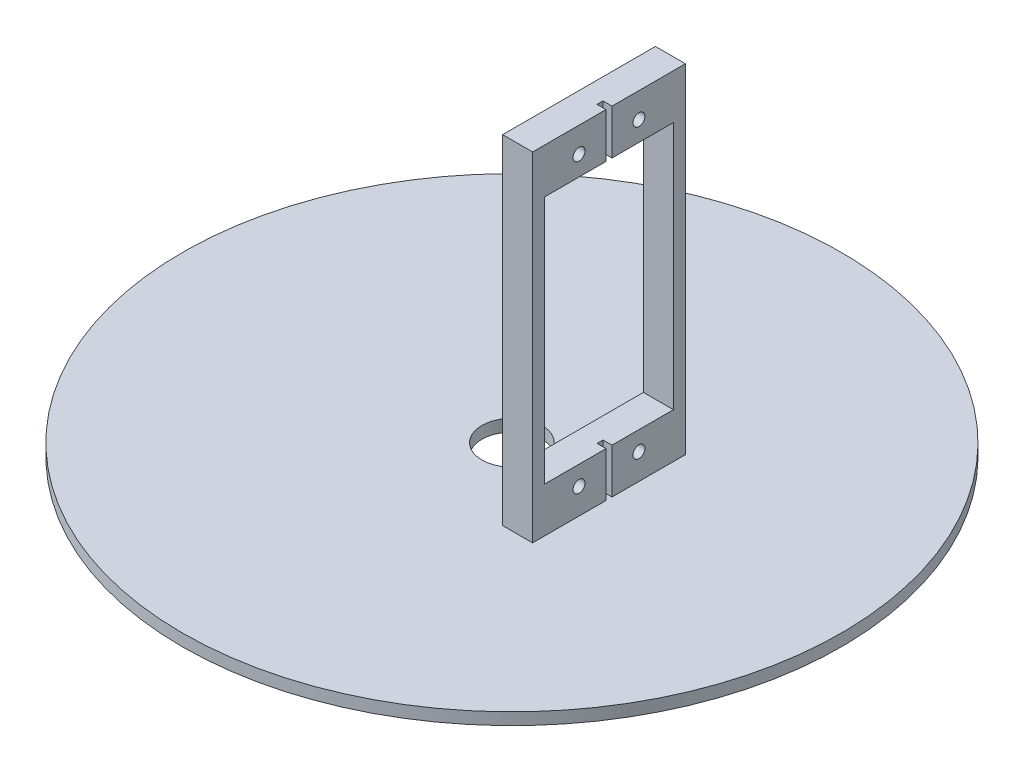
ISO-10303-21;
HEADER;
FILE_DESCRIPTION(('STEP AP214'),'2;1');
FILE_NAME('part.step','',(''),(''),'','','');
FILE_SCHEMA(('AUTOMOTIVE_DESIGN { 1 0 10303 214 1 1 1 1 }'));
ENDSEC;
DATA;
#1=APPLICATION_CONTEXT('core data for automotive mechanical design processes');
#2=APPLICATION_PROTOCOL_DEFINITION('international standard','automotive_design',2000,#1);
#3=PRODUCT_CONTEXT('',#1,'mechanical');
#4=PRODUCT('Part','Part','',(#3));
#5=PRODUCT_RELATED_PRODUCT_CATEGORY('part','',(#4));
#6=PRODUCT_DEFINITION_FORMATION('','',#4);
#7=PRODUCT_DEFINITION_CONTEXT('part definition',#1,'design');
#8=PRODUCT_DEFINITION('design','',#6,#7);
#9=PRODUCT_DEFINITION_SHAPE('','',#8);
#10=(LENGTH_UNIT() NAMED_UNIT(*) SI_UNIT(.MILLI.,.METRE.));
#11=(NAMED_UNIT(*) PLANE_ANGLE_UNIT() SI_UNIT($,.RADIAN.));
#12=(NAMED_UNIT(*) SI_UNIT($,.STERADIAN.) SOLID_ANGLE_UNIT());
#13=UNCERTAINTY_MEASURE_WITH_UNIT(LENGTH_MEASURE(1.E-05),#10,'distance_accuracy_value','');
#14=(GEOMETRIC_REPRESENTATION_CONTEXT(3) GLOBAL_UNCERTAINTY_ASSIGNED_CONTEXT((#13)) GLOBAL_UNIT_ASSIGNED_CONTEXT((#10,
#11,#12)) REPRESENTATION_CONTEXT('',''));
#15=CARTESIAN_POINT('',(0.,0.,0.));
#16=DIRECTION('',(0.,0.,1.));
#17=DIRECTION('',(1.,0.,0.));
#18=AXIS2_PLACEMENT_3D('',#15,#16,#17);
#19=CARTESIAN_POINT('',(16.2,0.,0.));
#20=DIRECTION('',(-1.,0.,0.));
#21=DIRECTION('',(0.,0.,1.));
#22=AXIS2_PLACEMENT_3D('',#19,#20,#21);
#23=PLANE('',#22);
#24=CARTESIAN_POINT('',(16.2,6.3,-5.));
#25=DIRECTION('',(1.,0.,0.));
#26=DIRECTION('',(0.,0.,1.));
#27=AXIS2_PLACEMENT_3D('',#24,#25,#26);
#28=CIRCLE('',#27,1.);
#29=CARTESIAN_POINT('',(16.2,6.3,-4.));
#30=VERTEX_POINT('',#29);
#31=EDGE_CURVE('E202',#30,#30,#28,.T.);
#32=ORIENTED_EDGE('',*,*,#31,.F.);
#33=EDGE_LOOP('',(#32));
#34=FACE_BOUND('',#33,.T.);
#35=CARTESIAN_POINT('',(16.2,54.3,-5.));
#36=DIRECTION('',(1.,0.,0.));
#37=DIRECTION('',(0.,0.,1.));
#38=AXIS2_PLACEMENT_3D('',#35,#36,#37);
#39=CIRCLE('',#38,1.);
#40=CARTESIAN_POINT('',(16.2,54.3,-4.));
#41=VERTEX_POINT('',#40);
#42=EDGE_CURVE('E199',#41,#41,#39,.T.);
#43=ORIENTED_EDGE('',*,*,#42,.F.);
#44=EDGE_LOOP('',(#43));
#45=FACE_BOUND('',#44,.T.);
#46=DIRECTION('',(0.,0.,1.));
#47=VECTOR('',#46,1.);
#48=CARTESIAN_POINT('',(16.2,58.5,12.75));
#49=LINE('',#48,#47);
#50=CARTESIAN_POINT('',(16.2,58.5,-12.75));
#51=VERTEX_POINT('',#50);
#52=CARTESIAN_POINT('',(16.2,58.5,-0.5));
#53=VERTEX_POINT('',#52);
#54=EDGE_CURVE('E284',#51,#53,#49,.T.);
#55=ORIENTED_EDGE('',*,*,#54,.T.);
#56=DIRECTION('',(0.,1.,0.));
#57=VECTOR('',#56,1.);
#58=CARTESIAN_POINT('',(16.2,58.5,-0.5));
#59=LINE('',#58,#57);
#60=CARTESIAN_POINT('',(16.2,51.,-0.500000000000001));
#61=VERTEX_POINT('',#60);
#62=EDGE_CURVE('E322',#61,#53,#59,.T.);
#63=ORIENTED_EDGE('',*,*,#62,.F.);
#64=DIRECTION('',(0.,0.,1.));
#65=VECTOR('',#64,1.);
#66=CARTESIAN_POINT('',(16.2,51.,10.75));
#67=LINE('',#66,#65);
#68=CARTESIAN_POINT('',(16.2,51.,-10.75));
#69=VERTEX_POINT('',#68);
#70=EDGE_CURVE('E228',#69,#61,#67,.T.);
#71=ORIENTED_EDGE('',*,*,#70,.F.);
#72=DIRECTION('',(0.,1.,0.));
#73=VECTOR('',#72,1.);
#74=CARTESIAN_POINT('',(16.2,51.,-10.75));
#75=LINE('',#74,#73);
#76=CARTESIAN_POINT('',(16.2,9.5,-10.75));
#77=VERTEX_POINT('',#76);
#78=EDGE_CURVE('E243',#77,#69,#75,.T.);
#79=ORIENTED_EDGE('',*,*,#78,.F.);
#80=DIRECTION('',(0.,0.,-1.));
#81=VECTOR('',#80,1.);
#82=CARTESIAN_POINT('',(16.2,9.5,-10.75));
#83=LINE('',#82,#81);
#84=CARTESIAN_POINT('',(16.2,9.5,-0.500000000000006));
#85=VERTEX_POINT('',#84);
#86=EDGE_CURVE('E238',#85,#77,#83,.T.);
#87=ORIENTED_EDGE('',*,*,#86,.F.);
#88=CARTESIAN_POINT('',(16.2,2.00000000000001,-0.500000000000007));
#89=VERTEX_POINT('',#88);
#90=EDGE_CURVE('E177',#89,#85,#59,.T.);
#91=ORIENTED_EDGE('',*,*,#90,.F.);
#92=DIRECTION('',(0.,0.,-1.));
#93=VECTOR('',#92,1.);
#94=CARTESIAN_POINT('',(16.2,2.,-12.75));
#95=LINE('',#94,#93);
#96=CARTESIAN_POINT('',(16.2,2.,-12.75));
#97=VERTEX_POINT('',#96);
#98=EDGE_CURVE('E251',#89,#97,#95,.T.);
#99=ORIENTED_EDGE('',*,*,#98,.T.);
#100=DIRECTION('',(0.,1.,0.));
#101=VECTOR('',#100,1.);
#102=CARTESIAN_POINT('',(16.2,58.5,-12.75));
#103=LINE('',#102,#101);
#104=EDGE_CURVE('E279',#97,#51,#103,.T.);
#105=ORIENTED_EDGE('',*,*,#104,.T.);
#106=EDGE_LOOP('',(#55,#63,#71,#79,#87,#91,#99,#105));
#107=FACE_BOUND('',#106,.T.);
#108=ADVANCED_FACE('F47',(#34,#45,#107),#23,.F.);
#109=CARTESIAN_POINT('',(0.,2.,0.));
#110=DIRECTION('',(0.,-1.,0.));
#111=DIRECTION('',(0.,0.,-1.));
#112=AXIS2_PLACEMENT_3D('',#109,#110,#111);
#113=CYLINDRICAL_SURFACE('',#112,55.);
#114=CARTESIAN_POINT('',(0.,2.,0.));
#115=DIRECTION('',(0.,1.,0.));
#116=DIRECTION('',(0.,0.,1.));
#117=AXIS2_PLACEMENT_3D('',#114,#115,#116);
#118=CIRCLE('',#117,55.);
#119=CARTESIAN_POINT('',(0.,2.,55.));
#120=VERTEX_POINT('',#119);
#121=EDGE_CURVE('E303',#120,#120,#118,.T.);
#122=ORIENTED_EDGE('',*,*,#121,.F.);
#123=EDGE_LOOP('',(#122));
#124=FACE_BOUND('',#123,.T.);
#125=CARTESIAN_POINT('',(0.,0.,0.));
#126=DIRECTION('',(0.,1.,0.));
#127=DIRECTION('',(0.,0.,1.));
#128=AXIS2_PLACEMENT_3D('',#125,#126,#127);
#129=CIRCLE('',#128,55.);
#130=CARTESIAN_POINT('',(0.,0.,55.));
#131=VERTEX_POINT('',#130);
#132=EDGE_CURVE('E300',#131,#131,#129,.T.);
#133=ORIENTED_EDGE('',*,*,#132,.T.);
#134=EDGE_LOOP('',(#133));
#135=FACE_BOUND('',#134,.T.);
#136=ADVANCED_FACE('F51',(#124,#135),#113,.T.);
#137=CARTESIAN_POINT('',(0.,2.,0.));
#138=DIRECTION('',(0.,1.,0.));
#139=DIRECTION('',(0.,0.,1.));
#140=AXIS2_PLACEMENT_3D('',#137,#138,#139);
#141=PLANE('',#140);
#142=DIRECTION('',(0.,0.,-1.));
#143=VECTOR('',#142,1.);
#144=CARTESIAN_POINT('',(11.2,2.,-12.75));
#145=LINE('',#144,#143);
#146=CARTESIAN_POINT('',(11.2,2.,12.75));
#147=VERTEX_POINT('',#146);
#148=CARTESIAN_POINT('',(11.2,2.,-12.75));
#149=VERTEX_POINT('',#148);
#150=EDGE_CURVE('E261',#147,#149,#145,.T.);
#151=ORIENTED_EDGE('',*,*,#150,.T.);
#152=DIRECTION('',(1.,0.,0.));
#153=VECTOR('',#152,1.);
#154=CARTESIAN_POINT('',(11.2,2.,-12.75));
#155=LINE('',#154,#153);
#156=EDGE_CURVE('E273',#149,#97,#155,.T.);
#157=ORIENTED_EDGE('',*,*,#156,.T.);
#158=ORIENTED_EDGE('',*,*,#98,.F.);
#159=DIRECTION('',(1.,0.,0.));
#160=VECTOR('',#159,1.);
#161=CARTESIAN_POINT('',(14.7,2.00000000000001,-0.500000000000007));
#162=LINE('',#161,#160);
#163=CARTESIAN_POINT('',(14.7,2.00000000000001,-0.500000000000007));
#164=VERTEX_POINT('',#163);
#165=EDGE_CURVE('E190',#164,#89,#162,.T.);
#166=ORIENTED_EDGE('',*,*,#165,.F.);
#167=DIRECTION('',(0.,0.,-1.));
#168=VECTOR('',#167,1.);
#169=CARTESIAN_POINT('',(14.7,2.00000000000001,0.499999999999993));
#170=LINE('',#169,#168);
#171=CARTESIAN_POINT('',(14.7,2.00000000000001,0.499999999999993));
#172=VERTEX_POINT('',#171);
#173=EDGE_CURVE('E169',#172,#164,#170,.T.);
#174=ORIENTED_EDGE('',*,*,#173,.F.);
#175=DIRECTION('',(1.,0.,0.));
#176=VECTOR('',#175,1.);
#177=CARTESIAN_POINT('',(14.7,2.00000000000001,0.499999999999993));
#178=LINE('',#177,#176);
#179=CARTESIAN_POINT('',(16.2,2.00000000000001,0.499999999999993));
#180=VERTEX_POINT('',#179);
#181=EDGE_CURVE('E183',#172,#180,#178,.T.);
#182=ORIENTED_EDGE('',*,*,#181,.T.);
#183=CARTESIAN_POINT('',(16.2,2.,12.75));
#184=VERTEX_POINT('',#183);
#185=EDGE_CURVE('E274',#184,#180,#95,.T.);
#186=ORIENTED_EDGE('',*,*,#185,.F.);
#187=DIRECTION('',(1.,0.,0.));
#188=VECTOR('',#187,1.);
#189=CARTESIAN_POINT('',(11.2,2.,12.75));
#190=LINE('',#189,#188);
#191=EDGE_CURVE('E282',#147,#184,#190,.T.);
#192=ORIENTED_EDGE('',*,*,#191,.F.);
#193=EDGE_LOOP('',(#151,#157,#158,#166,#174,#182,#186,#192));
#194=FACE_BOUND('',#193,.T.);
#195=CARTESIAN_POINT('',(0.,2.,0.));
#196=DIRECTION('',(0.,1.,0.));
#197=DIRECTION('',(0.,0.,1.));
#198=AXIS2_PLACEMENT_3D('',#195,#196,#197);
#199=CIRCLE('',#198,5.);
#200=CARTESIAN_POINT('',(0.,2.,5.));
#201=VERTEX_POINT('',#200);
#202=EDGE_CURVE('E286',#201,#201,#199,.T.);
#203=ORIENTED_EDGE('',*,*,#202,.F.);
#204=EDGE_LOOP('',(#203));
#205=FACE_BOUND('',#204,.T.);
#206=ORIENTED_EDGE('',*,*,#121,.T.);
#207=EDGE_LOOP('',(#206));
#208=FACE_BOUND('',#207,.T.);
#209=ADVANCED_FACE('F340',(#194,#205,#208),#141,.T.);
#210=CARTESIAN_POINT('',(0.,0.,0.));
#211=DIRECTION('',(0.,1.,0.));
#212=DIRECTION('',(0.,0.,1.));
#213=AXIS2_PLACEMENT_3D('',#210,#211,#212);
#214=PLANE('',#213);
#215=CARTESIAN_POINT('',(0.,0.,0.));
#216=DIRECTION('',(0.,1.,0.));
#217=DIRECTION('',(0.,0.,1.));
#218=AXIS2_PLACEMENT_3D('',#215,#216,#217);
#219=CIRCLE('',#218,5.);
#220=CARTESIAN_POINT('',(0.,0.,5.));
#221=VERTEX_POINT('',#220);
#222=EDGE_CURVE('E293',#221,#221,#219,.T.);
#223=ORIENTED_EDGE('',*,*,#222,.T.);
#224=EDGE_LOOP('',(#223));
#225=FACE_BOUND('',#224,.T.);
#226=ORIENTED_EDGE('',*,*,#132,.F.);
#227=EDGE_LOOP('',(#226));
#228=FACE_BOUND('',#227,.T.);
#229=ADVANCED_FACE('F378',(#225,#228),#214,.F.);
#230=CARTESIAN_POINT('',(0.,0.,0.));
#231=DIRECTION('',(0.,1.,0.));
#232=DIRECTION('',(0.,0.,1.));
#233=AXIS2_PLACEMENT_3D('',#230,#231,#232);
#234=CYLINDRICAL_SURFACE('',#233,5.);
#235=ORIENTED_EDGE('',*,*,#222,.F.);
#236=EDGE_LOOP('',(#235));
#237=FACE_BOUND('',#236,.T.);
#238=ORIENTED_EDGE('',*,*,#202,.T.);
#239=EDGE_LOOP('',(#238));
#240=FACE_BOUND('',#239,.T.);
#241=ADVANCED_FACE('F367',(#237,#240),#234,.F.);
#242=CARTESIAN_POINT('',(11.2,2.,12.75));
#243=DIRECTION('',(0.,0.,1.));
#244=DIRECTION('',(1.,0.,0.));
#245=AXIS2_PLACEMENT_3D('',#242,#243,#244);
#246=PLANE('',#245);
#247=DIRECTION('',(0.,-1.,0.));
#248=VECTOR('',#247,1.);
#249=CARTESIAN_POINT('',(16.2,2.,12.75));
#250=LINE('',#249,#248);
#251=CARTESIAN_POINT('',(16.2,58.5,12.75));
#252=VERTEX_POINT('',#251);
#253=EDGE_CURVE('E264',#252,#184,#250,.T.);
#254=ORIENTED_EDGE('',*,*,#253,.F.);
#255=DIRECTION('',(1.,0.,0.));
#256=VECTOR('',#255,1.);
#257=CARTESIAN_POINT('',(11.2,58.5,12.75));
#258=LINE('',#257,#256);
#259=CARTESIAN_POINT('',(11.2,58.5,12.75));
#260=VERTEX_POINT('',#259);
#261=EDGE_CURVE('E287',#260,#252,#258,.T.);
#262=ORIENTED_EDGE('',*,*,#261,.F.);
#263=DIRECTION('',(0.,-1.,0.));
#264=VECTOR('',#263,1.);
#265=CARTESIAN_POINT('',(11.2,2.,12.75));
#266=LINE('',#265,#264);
#267=EDGE_CURVE('E271',#260,#147,#266,.T.);
#268=ORIENTED_EDGE('',*,*,#267,.T.);
#269=ORIENTED_EDGE('',*,*,#191,.T.);
#270=EDGE_LOOP('',(#254,#262,#268,#269));
#271=FACE_BOUND('',#270,.T.);
#272=ADVANCED_FACE('F366',(#271),#246,.T.);
#273=CARTESIAN_POINT('',(11.2,58.5,12.75));
#274=DIRECTION('',(0.,1.,0.));
#275=DIRECTION('',(0.,0.,1.));
#276=AXIS2_PLACEMENT_3D('',#273,#274,#275);
#277=PLANE('',#276);
#278=DIRECTION('',(1.,0.,0.));
#279=VECTOR('',#278,1.);
#280=CARTESIAN_POINT('',(14.7,58.5,-0.5));
#281=LINE('',#280,#279);
#282=CARTESIAN_POINT('',(14.7,58.5,-0.5));
#283=VERTEX_POINT('',#282);
#284=EDGE_CURVE('E194',#283,#53,#281,.T.);
#285=ORIENTED_EDGE('',*,*,#284,.T.);
#286=ORIENTED_EDGE('',*,*,#54,.F.);
#287=DIRECTION('',(1.,0.,0.));
#288=VECTOR('',#287,1.);
#289=CARTESIAN_POINT('',(11.2,58.5,-12.75));
#290=LINE('',#289,#288);
#291=CARTESIAN_POINT('',(11.2,58.5,-12.75));
#292=VERTEX_POINT('',#291);
#293=EDGE_CURVE('E292',#292,#51,#290,.T.);
#294=ORIENTED_EDGE('',*,*,#293,.F.);
#295=DIRECTION('',(0.,0.,1.));
#296=VECTOR('',#295,1.);
#297=CARTESIAN_POINT('',(11.2,58.5,12.75));
#298=LINE('',#297,#296);
#299=EDGE_CURVE('E268',#292,#260,#298,.T.);
#300=ORIENTED_EDGE('',*,*,#299,.T.);
#301=ORIENTED_EDGE('',*,*,#261,.T.);
#302=CARTESIAN_POINT('',(16.2,58.5,0.5));
#303=VERTEX_POINT('',#302);
#304=EDGE_CURVE('E184',#303,#252,#49,.T.);
#305=ORIENTED_EDGE('',*,*,#304,.F.);
#306=DIRECTION('',(1.,0.,0.));
#307=VECTOR('',#306,1.);
#308=CARTESIAN_POINT('',(14.7,58.5,0.5));
#309=LINE('',#308,#307);
#310=CARTESIAN_POINT('',(14.7,58.5,0.5));
#311=VERTEX_POINT('',#310);
#312=EDGE_CURVE('E162',#311,#303,#309,.T.);
#313=ORIENTED_EDGE('',*,*,#312,.F.);
#314=DIRECTION('',(0.,0.,1.));
#315=VECTOR('',#314,1.);
#316=CARTESIAN_POINT('',(14.7,58.5,0.5));
#317=LINE('',#316,#315);
#318=EDGE_CURVE('E171',#283,#311,#317,.T.);
#319=ORIENTED_EDGE('',*,*,#318,.F.);
#320=EDGE_LOOP('',(#285,#286,#294,#300,#301,#305,#313,#319));
#321=FACE_BOUND('',#320,.T.);
#322=ADVANCED_FACE('F185',(#321),#277,.T.);
#323=CARTESIAN_POINT('',(11.2,58.5,-12.75));
#324=DIRECTION('',(0.,0.,-1.));
#325=DIRECTION('',(0.,1.,0.));
#326=AXIS2_PLACEMENT_3D('',#323,#324,#325);
#327=PLANE('',#326);
#328=ORIENTED_EDGE('',*,*,#104,.F.);
#329=ORIENTED_EDGE('',*,*,#156,.F.);
#330=DIRECTION('',(0.,1.,0.));
#331=VECTOR('',#330,1.);
#332=CARTESIAN_POINT('',(11.2,58.5,-12.75));
#333=LINE('',#332,#331);
#334=EDGE_CURVE('E262',#149,#292,#333,.T.);
#335=ORIENTED_EDGE('',*,*,#334,.T.);
#336=ORIENTED_EDGE('',*,*,#293,.T.);
#337=EDGE_LOOP('',(#328,#329,#335,#336));
#338=FACE_BOUND('',#337,.T.);
#339=ADVANCED_FACE('F341',(#338),#327,.T.);
#340=CARTESIAN_POINT('',(11.2,0.,0.));
#341=DIRECTION('',(-1.,0.,0.));
#342=DIRECTION('',(0.,0.,1.));
#343=AXIS2_PLACEMENT_3D('',#340,#341,#342);
#344=PLANE('',#343);
#345=CARTESIAN_POINT('',(11.2,54.3,-5.));
#346=DIRECTION('',(-1.,0.,0.));
#347=DIRECTION('',(0.,0.,1.));
#348=AXIS2_PLACEMENT_3D('',#345,#346,#347);
#349=CIRCLE('',#348,1.);
#350=CARTESIAN_POINT('',(11.2,54.3,-4.));
#351=VERTEX_POINT('',#350);
#352=EDGE_CURVE('E222',#351,#351,#349,.T.);
#353=ORIENTED_EDGE('',*,*,#352,.F.);
#354=EDGE_LOOP('',(#353));
#355=FACE_BOUND('',#354,.T.);
#356=CARTESIAN_POINT('',(11.2,6.3,-5.));
#357=DIRECTION('',(-1.,0.,0.));
#358=DIRECTION('',(0.,0.,1.));
#359=AXIS2_PLACEMENT_3D('',#356,#357,#358);
#360=CIRCLE('',#359,1.);
#361=CARTESIAN_POINT('',(11.2,6.3,-4.));
#362=VERTEX_POINT('',#361);
#363=EDGE_CURVE('E217',#362,#362,#360,.T.);
#364=ORIENTED_EDGE('',*,*,#363,.F.);
#365=EDGE_LOOP('',(#364));
#366=FACE_BOUND('',#365,.T.);
#367=CARTESIAN_POINT('',(11.2,6.3,5.));
#368=DIRECTION('',(-1.,0.,0.));
#369=DIRECTION('',(0.,0.,1.));
#370=AXIS2_PLACEMENT_3D('',#367,#368,#369);
#371=CIRCLE('',#370,1.);
#372=CARTESIAN_POINT('',(11.2,6.3,6.));
#373=VERTEX_POINT('',#372);
#374=EDGE_CURVE('E214',#373,#373,#371,.T.);
#375=ORIENTED_EDGE('',*,*,#374,.F.);
#376=EDGE_LOOP('',(#375));
#377=FACE_BOUND('',#376,.T.);
#378=CARTESIAN_POINT('',(11.2,54.3,5.));
#379=DIRECTION('',(-1.,0.,0.));
#380=DIRECTION('',(0.,0.,1.));
#381=AXIS2_PLACEMENT_3D('',#378,#379,#380);
#382=CIRCLE('',#381,1.);
#383=CARTESIAN_POINT('',(11.2,54.3,6.));
#384=VERTEX_POINT('',#383);
#385=EDGE_CURVE('E215',#384,#384,#382,.T.);
#386=ORIENTED_EDGE('',*,*,#385,.F.);
#387=EDGE_LOOP('',(#386));
#388=FACE_BOUND('',#387,.T.);
#389=DIRECTION('',(0.,-1.,0.));
#390=VECTOR('',#389,1.);
#391=CARTESIAN_POINT('',(11.2,9.5,10.75));
#392=LINE('',#391,#390);
#393=CARTESIAN_POINT('',(11.2,51.,10.75));
#394=VERTEX_POINT('',#393);
#395=CARTESIAN_POINT('',(11.2,9.5,10.75));
#396=VERTEX_POINT('',#395);
#397=EDGE_CURVE('E223',#394,#396,#392,.T.);
#398=ORIENTED_EDGE('',*,*,#397,.T.);
#399=DIRECTION('',(0.,0.,-1.));
#400=VECTOR('',#399,1.);
#401=CARTESIAN_POINT('',(11.2,9.5,-10.75));
#402=LINE('',#401,#400);
#403=CARTESIAN_POINT('',(11.2,9.5,-10.75));
#404=VERTEX_POINT('',#403);
#405=EDGE_CURVE('E230',#396,#404,#402,.T.);
#406=ORIENTED_EDGE('',*,*,#405,.T.);
#407=DIRECTION('',(0.,1.,0.));
#408=VECTOR('',#407,1.);
#409=CARTESIAN_POINT('',(11.2,51.,-10.75));
#410=LINE('',#409,#408);
#411=CARTESIAN_POINT('',(11.2,51.,-10.75));
#412=VERTEX_POINT('',#411);
#413=EDGE_CURVE('E235',#404,#412,#410,.T.);
#414=ORIENTED_EDGE('',*,*,#413,.T.);
#415=DIRECTION('',(0.,0.,1.));
#416=VECTOR('',#415,1.);
#417=CARTESIAN_POINT('',(11.2,51.,10.75));
#418=LINE('',#417,#416);
#419=EDGE_CURVE('E234',#412,#394,#418,.T.);
#420=ORIENTED_EDGE('',*,*,#419,.T.);
#421=EDGE_LOOP('',(#398,#406,#414,#420));
#422=FACE_BOUND('',#421,.T.);
#423=ORIENTED_EDGE('',*,*,#150,.F.);
#424=ORIENTED_EDGE('',*,*,#267,.F.);
#425=ORIENTED_EDGE('',*,*,#299,.F.);
#426=ORIENTED_EDGE('',*,*,#334,.F.);
#427=EDGE_LOOP('',(#423,#424,#425,#426));
#428=FACE_BOUND('',#427,.T.);
#429=ADVANCED_FACE('F347',(#355,#366,#377,#388,#422,#428),#344,.T.);
#430=CARTESIAN_POINT('',(16.2,6.3,5.));
#431=DIRECTION('',(1.,0.,0.));
#432=DIRECTION('',(0.,0.,-1.));
#433=AXIS2_PLACEMENT_3D('',#430,#431,#432);
#434=CIRCLE('',#433,1.);
#435=CARTESIAN_POINT('',(16.2,6.3,4.));
#436=VERTEX_POINT('',#435);
#437=EDGE_CURVE('E203',#436,#436,#434,.T.);
#438=ORIENTED_EDGE('',*,*,#437,.F.);
#439=EDGE_LOOP('',(#438));
#440=FACE_BOUND('',#439,.T.);
#441=CARTESIAN_POINT('',(16.2,54.3,5.));
#442=DIRECTION('',(1.,0.,0.));
#443=DIRECTION('',(0.,0.,-1.));
#444=AXIS2_PLACEMENT_3D('',#441,#442,#443);
#445=CIRCLE('',#444,1.);
#446=CARTESIAN_POINT('',(16.2,54.3,4.));
#447=VERTEX_POINT('',#446);
#448=EDGE_CURVE('E204',#447,#447,#445,.T.);
#449=ORIENTED_EDGE('',*,*,#448,.F.);
#450=EDGE_LOOP('',(#449));
#451=FACE_BOUND('',#450,.T.);
#452=ORIENTED_EDGE('',*,*,#185,.T.);
#453=DIRECTION('',(0.,-1.,0.));
#454=VECTOR('',#453,1.);
#455=CARTESIAN_POINT('',(16.2,58.5,0.5));
#456=LINE('',#455,#454);
#457=CARTESIAN_POINT('',(16.2,9.5,0.499999999999994));
#458=VERTEX_POINT('',#457);
#459=EDGE_CURVE('E320',#458,#180,#456,.T.);
#460=ORIENTED_EDGE('',*,*,#459,.F.);
#461=CARTESIAN_POINT('',(16.2,9.5,10.75));
#462=VERTEX_POINT('',#461);
#463=EDGE_CURVE('E244',#462,#458,#83,.T.);
#464=ORIENTED_EDGE('',*,*,#463,.F.);
#465=DIRECTION('',(0.,-1.,0.));
#466=VECTOR('',#465,1.);
#467=CARTESIAN_POINT('',(16.2,9.5,10.75));
#468=LINE('',#467,#466);
#469=CARTESIAN_POINT('',(16.2,51.,10.75));
#470=VERTEX_POINT('',#469);
#471=EDGE_CURVE('E221',#470,#462,#468,.T.);
#472=ORIENTED_EDGE('',*,*,#471,.F.);
#473=CARTESIAN_POINT('',(16.2,51.,0.499999999999999));
#474=VERTEX_POINT('',#473);
#475=EDGE_CURVE('E250',#474,#470,#67,.T.);
#476=ORIENTED_EDGE('',*,*,#475,.F.);
#477=EDGE_CURVE('E325',#303,#474,#456,.T.);
#478=ORIENTED_EDGE('',*,*,#477,.F.);
#479=ORIENTED_EDGE('',*,*,#304,.T.);
#480=ORIENTED_EDGE('',*,*,#253,.T.);
#481=EDGE_LOOP('',(#452,#460,#464,#472,#476,#478,#479,#480));
#482=FACE_BOUND('',#481,.T.);
#483=ADVANCED_FACE('F317',(#440,#451,#482),#23,.F.);
#484=CARTESIAN_POINT('',(11.2,9.5,10.75));
#485=DIRECTION('',(0.,0.,1.));
#486=DIRECTION('',(0.,-1.,0.));
#487=AXIS2_PLACEMENT_3D('',#484,#485,#486);
#488=PLANE('',#487);
#489=ORIENTED_EDGE('',*,*,#471,.T.);
#490=DIRECTION('',(1.,0.,0.));
#491=VECTOR('',#490,1.);
#492=CARTESIAN_POINT('',(11.2,9.5,10.75));
#493=LINE('',#492,#491);
#494=EDGE_CURVE('E236',#396,#462,#493,.T.);
#495=ORIENTED_EDGE('',*,*,#494,.F.);
#496=ORIENTED_EDGE('',*,*,#397,.F.);
#497=DIRECTION('',(1.,0.,0.));
#498=VECTOR('',#497,1.);
#499=CARTESIAN_POINT('',(11.2,51.,10.75));
#500=LINE('',#499,#498);
#501=EDGE_CURVE('E249',#394,#470,#500,.T.);
#502=ORIENTED_EDGE('',*,*,#501,.T.);
#503=EDGE_LOOP('',(#489,#495,#496,#502));
#504=FACE_BOUND('',#503,.T.);
#505=ADVANCED_FACE('F361',(#504),#488,.F.);
#506=CARTESIAN_POINT('',(11.2,51.,10.75));
#507=DIRECTION('',(0.,1.,0.));
#508=DIRECTION('',(0.,0.,1.));
#509=AXIS2_PLACEMENT_3D('',#506,#507,#508);
#510=PLANE('',#509);
#511=ORIENTED_EDGE('',*,*,#70,.T.);
#512=DIRECTION('',(-1.,0.,0.));
#513=VECTOR('',#512,1.);
#514=CARTESIAN_POINT('',(11.2,51.,-0.500000000000002));
#515=LINE('',#514,#513);
#516=CARTESIAN_POINT('',(14.7,51.,-0.500000000000001));
#517=VERTEX_POINT('',#516);
#518=EDGE_CURVE('E197',#61,#517,#515,.T.);
#519=ORIENTED_EDGE('',*,*,#518,.T.);
#520=DIRECTION('',(0.,0.,1.));
#521=VECTOR('',#520,1.);
#522=CARTESIAN_POINT('',(14.7,51.,10.75));
#523=LINE('',#522,#521);
#524=CARTESIAN_POINT('',(14.7,51.,0.5));
#525=VERTEX_POINT('',#524);
#526=EDGE_CURVE('E191',#517,#525,#523,.T.);
#527=ORIENTED_EDGE('',*,*,#526,.T.);
#528=DIRECTION('',(1.,0.,0.));
#529=VECTOR('',#528,1.);
#530=CARTESIAN_POINT('',(11.2,51.,0.499999999999999));
#531=LINE('',#530,#529);
#532=EDGE_CURVE('E167',#525,#474,#531,.T.);
#533=ORIENTED_EDGE('',*,*,#532,.T.);
#534=ORIENTED_EDGE('',*,*,#475,.T.);
#535=ORIENTED_EDGE('',*,*,#501,.F.);
#536=ORIENTED_EDGE('',*,*,#419,.F.);
#537=DIRECTION('',(1.,0.,0.));
#538=VECTOR('',#537,1.);
#539=CARTESIAN_POINT('',(11.2,51.,-10.75));
#540=LINE('',#539,#538);
#541=EDGE_CURVE('E255',#412,#69,#540,.T.);
#542=ORIENTED_EDGE('',*,*,#541,.T.);
#543=EDGE_LOOP('',(#511,#519,#527,#533,#534,#535,#536,#542));
#544=FACE_BOUND('',#543,.T.);
#545=ADVANCED_FACE('F353',(#544),#510,.F.);
#546=CARTESIAN_POINT('',(11.2,51.,-10.75));
#547=DIRECTION('',(0.,0.,-1.));
#548=DIRECTION('',(0.,1.,0.));
#549=AXIS2_PLACEMENT_3D('',#546,#547,#548);
#550=PLANE('',#549);
#551=ORIENTED_EDGE('',*,*,#78,.T.);
#552=ORIENTED_EDGE('',*,*,#541,.F.);
#553=ORIENTED_EDGE('',*,*,#413,.F.);
#554=DIRECTION('',(1.,0.,0.));
#555=VECTOR('',#554,1.);
#556=CARTESIAN_POINT('',(11.2,9.5,-10.75));
#557=LINE('',#556,#555);
#558=EDGE_CURVE('E258',#404,#77,#557,.T.);
#559=ORIENTED_EDGE('',*,*,#558,.T.);
#560=EDGE_LOOP('',(#551,#552,#553,#559));
#561=FACE_BOUND('',#560,.T.);
#562=ADVANCED_FACE('F360',(#561),#550,.F.);
#563=CARTESIAN_POINT('',(11.2,9.5,-10.75));
#564=DIRECTION('',(0.,-1.,0.));
#565=DIRECTION('',(0.,0.,-1.));
#566=AXIS2_PLACEMENT_3D('',#563,#564,#565);
#567=PLANE('',#566);
#568=DIRECTION('',(0.,0.,-1.));
#569=VECTOR('',#568,1.);
#570=CARTESIAN_POINT('',(14.7,9.5,-10.75));
#571=LINE('',#570,#569);
#572=CARTESIAN_POINT('',(14.7,9.5,0.499999999999994));
#573=VERTEX_POINT('',#572);
#574=CARTESIAN_POINT('',(14.7,9.5,-0.500000000000007));
#575=VERTEX_POINT('',#574);
#576=EDGE_CURVE('E302',#573,#575,#571,.T.);
#577=ORIENTED_EDGE('',*,*,#576,.T.);
#578=DIRECTION('',(1.,0.,0.));
#579=VECTOR('',#578,1.);
#580=CARTESIAN_POINT('',(11.2,9.5,-0.500000000000006));
#581=LINE('',#580,#579);
#582=EDGE_CURVE('E11',#575,#85,#581,.T.);
#583=ORIENTED_EDGE('',*,*,#582,.T.);
#584=ORIENTED_EDGE('',*,*,#86,.T.);
#585=ORIENTED_EDGE('',*,*,#558,.F.);
#586=ORIENTED_EDGE('',*,*,#405,.F.);
#587=ORIENTED_EDGE('',*,*,#494,.T.);
#588=ORIENTED_EDGE('',*,*,#463,.T.);
#589=DIRECTION('',(-1.,0.,0.));
#590=VECTOR('',#589,1.);
#591=CARTESIAN_POINT('',(11.2,9.5,0.499999999999995));
#592=LINE('',#591,#590);
#593=EDGE_CURVE('E60',#458,#573,#592,.T.);
#594=ORIENTED_EDGE('',*,*,#593,.T.);
#595=EDGE_LOOP('',(#577,#583,#584,#585,#586,#587,#588,#594));
#596=FACE_BOUND('',#595,.T.);
#597=ADVANCED_FACE('F309',(#596),#567,.F.);
#598=CARTESIAN_POINT('',(-55.,54.3,5.));
#599=DIRECTION('',(1.,0.,0.));
#600=DIRECTION('',(0.,0.,-1.));
#601=AXIS2_PLACEMENT_3D('',#598,#599,#600);
#602=CYLINDRICAL_SURFACE('',#601,1.);
#603=ORIENTED_EDGE('',*,*,#385,.T.);
#604=EDGE_LOOP('',(#603));
#605=FACE_BOUND('',#604,.T.);
#606=ORIENTED_EDGE('',*,*,#448,.T.);
#607=EDGE_LOOP('',(#606));
#608=FACE_BOUND('',#607,.T.);
#609=ADVANCED_FACE('F409',(#605,#608),#602,.F.);
#610=CARTESIAN_POINT('',(-55.,6.3,5.));
#611=DIRECTION('',(1.,0.,0.));
#612=DIRECTION('',(0.,0.,-1.));
#613=AXIS2_PLACEMENT_3D('',#610,#611,#612);
#614=CYLINDRICAL_SURFACE('',#613,1.);
#615=ORIENTED_EDGE('',*,*,#374,.T.);
#616=EDGE_LOOP('',(#615));
#617=FACE_BOUND('',#616,.T.);
#618=ORIENTED_EDGE('',*,*,#437,.T.);
#619=EDGE_LOOP('',(#618));
#620=FACE_BOUND('',#619,.T.);
#621=ADVANCED_FACE('F410',(#617,#620),#614,.F.);
#622=CARTESIAN_POINT('',(-55.,6.3,-5.));
#623=DIRECTION('',(1.,0.,0.));
#624=DIRECTION('',(0.,0.,-1.));
#625=AXIS2_PLACEMENT_3D('',#622,#623,#624);
#626=CYLINDRICAL_SURFACE('',#625,1.);
#627=ORIENTED_EDGE('',*,*,#363,.T.);
#628=EDGE_LOOP('',(#627));
#629=FACE_BOUND('',#628,.T.);
#630=ORIENTED_EDGE('',*,*,#31,.T.);
#631=EDGE_LOOP('',(#630));
#632=FACE_BOUND('',#631,.T.);
#633=ADVANCED_FACE('F412',(#629,#632),#626,.F.);
#634=CARTESIAN_POINT('',(-55.,54.3,-5.));
#635=DIRECTION('',(1.,0.,0.));
#636=DIRECTION('',(0.,0.,-1.));
#637=AXIS2_PLACEMENT_3D('',#634,#635,#636);
#638=CYLINDRICAL_SURFACE('',#637,1.);
#639=ORIENTED_EDGE('',*,*,#352,.T.);
#640=EDGE_LOOP('',(#639));
#641=FACE_BOUND('',#640,.T.);
#642=ORIENTED_EDGE('',*,*,#42,.T.);
#643=EDGE_LOOP('',(#642));
#644=FACE_BOUND('',#643,.T.);
#645=ADVANCED_FACE('F423',(#641,#644),#638,.F.);
#646=CARTESIAN_POINT('',(14.7,0.,0.));
#647=DIRECTION('',(-1.,0.,0.));
#648=DIRECTION('',(0.,0.,1.));
#649=AXIS2_PLACEMENT_3D('',#646,#647,#648);
#650=PLANE('',#649);
#651=DIRECTION('',(0.,-1.,0.));
#652=VECTOR('',#651,1.);
#653=CARTESIAN_POINT('',(14.7,58.5,0.5));
#654=LINE('',#653,#652);
#655=EDGE_CURVE('E166',#573,#172,#654,.T.);
#656=ORIENTED_EDGE('',*,*,#655,.T.);
#657=ORIENTED_EDGE('',*,*,#173,.T.);
#658=DIRECTION('',(0.,1.,0.));
#659=VECTOR('',#658,1.);
#660=CARTESIAN_POINT('',(14.7,58.5,-0.5));
#661=LINE('',#660,#659);
#662=EDGE_CURVE('E75',#164,#575,#661,.T.);
#663=ORIENTED_EDGE('',*,*,#662,.T.);
#664=ORIENTED_EDGE('',*,*,#576,.F.);
#665=EDGE_LOOP('',(#656,#657,#663,#664));
#666=FACE_BOUND('',#665,.T.);
#667=ADVANCED_FACE('F368',(#666),#650,.F.);
#668=CARTESIAN_POINT('',(14.7,58.5,0.5));
#669=DIRECTION('',(0.,0.,1.));
#670=DIRECTION('',(0.,-1.,0.));
#671=AXIS2_PLACEMENT_3D('',#668,#669,#670);
#672=PLANE('',#671);
#673=ORIENTED_EDGE('',*,*,#459,.T.);
#674=ORIENTED_EDGE('',*,*,#181,.F.);
#675=ORIENTED_EDGE('',*,*,#655,.F.);
#676=ORIENTED_EDGE('',*,*,#593,.F.);
#677=EDGE_LOOP('',(#673,#674,#675,#676));
#678=FACE_BOUND('',#677,.T.);
#679=ADVANCED_FACE('F312',(#678),#672,.F.);
#680=CARTESIAN_POINT('',(14.7,58.5,-0.5));
#681=DIRECTION('',(0.,0.,-1.));
#682=DIRECTION('',(0.,1.,0.));
#683=AXIS2_PLACEMENT_3D('',#680,#681,#682);
#684=PLANE('',#683);
#685=ORIENTED_EDGE('',*,*,#662,.F.);
#686=ORIENTED_EDGE('',*,*,#165,.T.);
#687=ORIENTED_EDGE('',*,*,#90,.T.);
#688=ORIENTED_EDGE('',*,*,#582,.F.);
#689=EDGE_LOOP('',(#685,#686,#687,#688));
#690=FACE_BOUND('',#689,.T.);
#691=ADVANCED_FACE('F329',(#690),#684,.F.);
#692=ORIENTED_EDGE('',*,*,#62,.T.);
#693=ORIENTED_EDGE('',*,*,#284,.F.);
#694=EDGE_CURVE('E172',#517,#283,#661,.T.);
#695=ORIENTED_EDGE('',*,*,#694,.F.);
#696=ORIENTED_EDGE('',*,*,#518,.F.);
#697=EDGE_LOOP('',(#692,#693,#695,#696));
#698=FACE_BOUND('',#697,.T.);
#699=ADVANCED_FACE('F364',(#698),#684,.F.);
#700=EDGE_CURVE('E63',#311,#525,#654,.T.);
#701=ORIENTED_EDGE('',*,*,#700,.F.);
#702=ORIENTED_EDGE('',*,*,#312,.T.);
#703=ORIENTED_EDGE('',*,*,#477,.T.);
#704=ORIENTED_EDGE('',*,*,#532,.F.);
#705=EDGE_LOOP('',(#701,#702,#703,#704));
#706=FACE_BOUND('',#705,.T.);
#707=ADVANCED_FACE('F161',(#706),#672,.F.);
#708=ORIENTED_EDGE('',*,*,#694,.T.);
#709=ORIENTED_EDGE('',*,*,#318,.T.);
#710=ORIENTED_EDGE('',*,*,#700,.T.);
#711=ORIENTED_EDGE('',*,*,#526,.F.);
#712=EDGE_LOOP('',(#708,#709,#710,#711));
#713=FACE_BOUND('',#712,.T.);
#714=ADVANCED_FACE('F175',(#713),#650,.F.);
#715=CLOSED_SHELL('',(#108,#136,#209,#229,#241,#272,#322,#339,#429,#483,#505,#545,#562,#597,
#609,#621,#633,#645,#667,#679,#691,#699,#707,#714));
#716=MANIFOLD_SOLID_BREP('B2',#715);
#717=ADVANCED_BREP_SHAPE_REPRESENTATION('',(#18,#716),#14);
#718=SHAPE_DEFINITION_REPRESENTATION(#9,#717);
ENDSEC;
END-ISO-10303-21;
